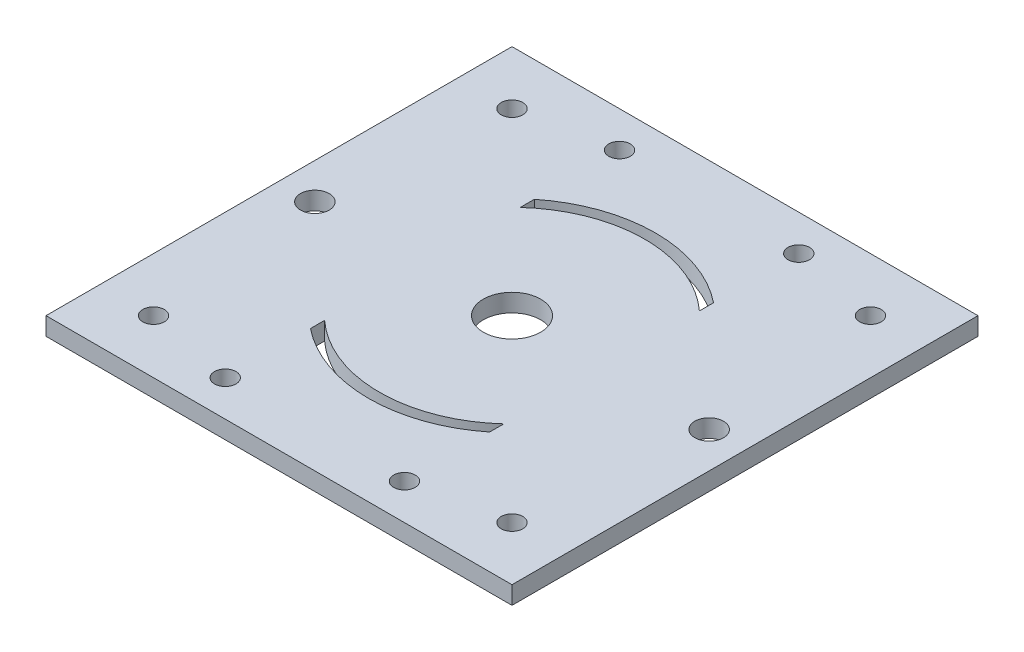
ISO-10303-21;
HEADER;
FILE_DESCRIPTION(('STEP AP214'),'2;1');
FILE_NAME('part.step','',(''),(''),'','','');
FILE_SCHEMA(('AUTOMOTIVE_DESIGN { 1 0 10303 214 1 1 1 1 }'));
ENDSEC;
DATA;
#1=APPLICATION_CONTEXT('core data for automotive mechanical design processes');
#2=APPLICATION_PROTOCOL_DEFINITION('international standard','automotive_design',2000,#1);
#3=PRODUCT_CONTEXT('',#1,'mechanical');
#4=PRODUCT('Part','Part','',(#3));
#5=PRODUCT_RELATED_PRODUCT_CATEGORY('part','',(#4));
#6=PRODUCT_DEFINITION_FORMATION('','',#4);
#7=PRODUCT_DEFINITION_CONTEXT('part definition',#1,'design');
#8=PRODUCT_DEFINITION('design','',#6,#7);
#9=PRODUCT_DEFINITION_SHAPE('','',#8);
#10=(LENGTH_UNIT() NAMED_UNIT(*) SI_UNIT(.MILLI.,.METRE.));
#11=(NAMED_UNIT(*) PLANE_ANGLE_UNIT() SI_UNIT($,.RADIAN.));
#12=(NAMED_UNIT(*) SI_UNIT($,.STERADIAN.) SOLID_ANGLE_UNIT());
#13=UNCERTAINTY_MEASURE_WITH_UNIT(LENGTH_MEASURE(1.E-05),#10,'distance_accuracy_value','');
#14=(GEOMETRIC_REPRESENTATION_CONTEXT(3) GLOBAL_UNCERTAINTY_ASSIGNED_CONTEXT((#13)) GLOBAL_UNIT_ASSIGNED_CONTEXT((#10,
#11,#12)) REPRESENTATION_CONTEXT('',''));
#15=CARTESIAN_POINT('',(0.,0.,0.));
#16=DIRECTION('',(0.,0.,1.));
#17=DIRECTION('',(1.,0.,0.));
#18=AXIS2_PLACEMENT_3D('',#15,#16,#17);
#19=CARTESIAN_POINT('',(0.,5.,0.));
#20=DIRECTION('',(0.,1.,0.));
#21=DIRECTION('',(0.,0.,1.));
#22=AXIS2_PLACEMENT_3D('',#19,#20,#21);
#23=PLANE('',#22);
#24=CARTESIAN_POINT('',(0.,5.,0.));
#25=DIRECTION('',(0.,-1.,0.));
#26=DIRECTION('',(0.,0.,1.));
#27=AXIS2_PLACEMENT_3D('',#24,#25,#26);
#28=CIRCLE('',#27,37.);
#29=CARTESIAN_POINT('',(25.,5.,27.2763633939717));
#30=VERTEX_POINT('',#29);
#31=CARTESIAN_POINT('',(-25.,5.,27.2763633939717));
#32=VERTEX_POINT('',#31);
#33=EDGE_CURVE('E54',#30,#32,#28,.T.);
#34=ORIENTED_EDGE('',*,*,#33,.F.);
#35=DIRECTION('',(0.,0.,-1.));
#36=VECTOR('',#35,1.);
#37=CARTESIAN_POINT('',(25.,5.,27.2763633939717));
#38=LINE('',#37,#36);
#39=CARTESIAN_POINT('',(25.,5.,31.224989991992));
#40=VERTEX_POINT('',#39);
#41=EDGE_CURVE('E153',#40,#30,#38,.T.);
#42=ORIENTED_EDGE('',*,*,#41,.F.);
#43=CARTESIAN_POINT('',(0.,5.,0.));
#44=DIRECTION('',(0.,1.,0.));
#45=DIRECTION('',(0.,0.,1.));
#46=AXIS2_PLACEMENT_3D('',#43,#44,#45);
#47=CIRCLE('',#46,40.);
#48=CARTESIAN_POINT('',(-25.,5.,31.224989991992));
#49=VERTEX_POINT('',#48);
#50=EDGE_CURVE('E135',#49,#40,#47,.T.);
#51=ORIENTED_EDGE('',*,*,#50,.F.);
#52=DIRECTION('',(0.,0.,1.));
#53=VECTOR('',#52,1.);
#54=CARTESIAN_POINT('',(-25.,5.,27.2763633939717));
#55=LINE('',#54,#53);
#56=EDGE_CURVE('E146',#32,#49,#55,.T.);
#57=ORIENTED_EDGE('',*,*,#56,.F.);
#58=EDGE_LOOP('',(#34,#42,#51,#57));
#59=FACE_BOUND('',#58,.T.);
#60=CARTESIAN_POINT('',(0.,5.,0.));
#61=DIRECTION('',(0.,1.,0.));
#62=DIRECTION('',(0.,0.,1.));
#63=AXIS2_PLACEMENT_3D('',#60,#61,#62);
#64=CIRCLE('',#63,40.);
#65=CARTESIAN_POINT('',(25.,5.,-31.224989991992));
#66=VERTEX_POINT('',#65);
#67=CARTESIAN_POINT('',(-25.,5.,-31.224989991992));
#68=VERTEX_POINT('',#67);
#69=EDGE_CURVE('E62',#66,#68,#64,.T.);
#70=ORIENTED_EDGE('',*,*,#69,.F.);
#71=DIRECTION('',(0.,0.,-1.));
#72=VECTOR('',#71,1.);
#73=CARTESIAN_POINT('',(25.,5.,-31.224989991992));
#74=LINE('',#73,#72);
#75=CARTESIAN_POINT('',(25.,5.,-27.2763633939717));
#76=VERTEX_POINT('',#75);
#77=EDGE_CURVE('E178',#76,#66,#74,.T.);
#78=ORIENTED_EDGE('',*,*,#77,.F.);
#79=CARTESIAN_POINT('',(0.,5.,0.));
#80=DIRECTION('',(0.,-1.,0.));
#81=DIRECTION('',(0.,0.,1.));
#82=AXIS2_PLACEMENT_3D('',#79,#80,#81);
#83=CIRCLE('',#82,37.);
#84=CARTESIAN_POINT('',(-25.,5.,-27.2763633939717));
#85=VERTEX_POINT('',#84);
#86=EDGE_CURVE('E174',#85,#76,#83,.T.);
#87=ORIENTED_EDGE('',*,*,#86,.F.);
#88=DIRECTION('',(0.,0.,1.));
#89=VECTOR('',#88,1.);
#90=CARTESIAN_POINT('',(-25.,5.,-31.224989991992));
#91=LINE('',#90,#89);
#92=EDGE_CURVE('E170',#68,#85,#91,.T.);
#93=ORIENTED_EDGE('',*,*,#92,.F.);
#94=EDGE_LOOP('',(#70,#78,#87,#93));
#95=FACE_BOUND('',#94,.T.);
#96=CARTESIAN_POINT('',(25.,5.,-55.));
#97=DIRECTION('',(0.,1.,0.));
#98=DIRECTION('',(0.,0.,-1.));
#99=AXIS2_PLACEMENT_3D('',#96,#97,#98);
#100=CIRCLE('',#99,3.);
#101=CARTESIAN_POINT('',(25.,5.,-58.));
#102=VERTEX_POINT('',#101);
#103=EDGE_CURVE('E198',#102,#102,#100,.T.);
#104=ORIENTED_EDGE('',*,*,#103,.F.);
#105=EDGE_LOOP('',(#104));
#106=FACE_BOUND('',#105,.T.);
#107=CARTESIAN_POINT('',(-25.,5.,55.));
#108=DIRECTION('',(0.,1.,0.));
#109=DIRECTION('',(0.,0.,-1.));
#110=AXIS2_PLACEMENT_3D('',#107,#108,#109);
#111=CIRCLE('',#110,3.);
#112=CARTESIAN_POINT('',(-25.,5.,52.));
#113=VERTEX_POINT('',#112);
#114=EDGE_CURVE('E197',#113,#113,#111,.T.);
#115=ORIENTED_EDGE('',*,*,#114,.F.);
#116=EDGE_LOOP('',(#115));
#117=FACE_BOUND('',#116,.T.);
#118=CARTESIAN_POINT('',(25.,5.,55.));
#119=DIRECTION('',(0.,1.,0.));
#120=DIRECTION('',(0.,0.,1.));
#121=AXIS2_PLACEMENT_3D('',#118,#119,#120);
#122=CIRCLE('',#121,3.);
#123=CARTESIAN_POINT('',(25.,5.,58.));
#124=VERTEX_POINT('',#123);
#125=EDGE_CURVE('E163',#124,#124,#122,.T.);
#126=ORIENTED_EDGE('',*,*,#125,.F.);
#127=EDGE_LOOP('',(#126));
#128=FACE_BOUND('',#127,.T.);
#129=CARTESIAN_POINT('',(-25.,5.,-55.));
#130=DIRECTION('',(0.,1.,0.));
#131=DIRECTION('',(0.,0.,1.));
#132=AXIS2_PLACEMENT_3D('',#129,#130,#131);
#133=CIRCLE('',#132,3.);
#134=CARTESIAN_POINT('',(-25.,5.,-52.));
#135=VERTEX_POINT('',#134);
#136=EDGE_CURVE('E202',#135,#135,#133,.T.);
#137=ORIENTED_EDGE('',*,*,#136,.F.);
#138=EDGE_LOOP('',(#137));
#139=FACE_BOUND('',#138,.T.);
#140=CARTESIAN_POINT('',(-55.,5.,0.));
#141=DIRECTION('',(0.,1.,0.));
#142=DIRECTION('',(0.,0.,1.));
#143=AXIS2_PLACEMENT_3D('',#140,#141,#142);
#144=CIRCLE('',#143,4.00000000000001);
#145=CARTESIAN_POINT('',(-55.,5.,4.00000000000001));
#146=VERTEX_POINT('',#145);
#147=EDGE_CURVE('E210',#146,#146,#144,.T.);
#148=ORIENTED_EDGE('',*,*,#147,.F.);
#149=EDGE_LOOP('',(#148));
#150=FACE_BOUND('',#149,.T.);
#151=CARTESIAN_POINT('',(55.,5.,0.));
#152=DIRECTION('',(0.,1.,0.));
#153=DIRECTION('',(0.,0.,-1.));
#154=AXIS2_PLACEMENT_3D('',#151,#152,#153);
#155=CIRCLE('',#154,4.00000000000001);
#156=CARTESIAN_POINT('',(55.,5.,-4.00000000000001));
#157=VERTEX_POINT('',#156);
#158=EDGE_CURVE('E220',#157,#157,#155,.T.);
#159=ORIENTED_EDGE('',*,*,#158,.F.);
#160=EDGE_LOOP('',(#159));
#161=FACE_BOUND('',#160,.T.);
#162=CARTESIAN_POINT('',(0.,5.,0.));
#163=DIRECTION('',(0.,1.,0.));
#164=DIRECTION('',(0.,0.,1.));
#165=AXIS2_PLACEMENT_3D('',#162,#163,#164);
#166=CIRCLE('',#165,8.);
#167=CARTESIAN_POINT('',(0.,5.,8.));
#168=VERTEX_POINT('',#167);
#169=EDGE_CURVE('E219',#168,#168,#166,.T.);
#170=ORIENTED_EDGE('',*,*,#169,.F.);
#171=EDGE_LOOP('',(#170));
#172=FACE_BOUND('',#171,.T.);
#173=CARTESIAN_POINT('',(50.,5.,50.));
#174=DIRECTION('',(0.,1.,0.));
#175=DIRECTION('',(0.,0.,1.));
#176=AXIS2_PLACEMENT_3D('',#173,#174,#175);
#177=CIRCLE('',#176,3.);
#178=CARTESIAN_POINT('',(50.,5.,53.));
#179=VERTEX_POINT('',#178);
#180=EDGE_CURVE('E244',#179,#179,#177,.T.);
#181=ORIENTED_EDGE('',*,*,#180,.F.);
#182=EDGE_LOOP('',(#181));
#183=FACE_BOUND('',#182,.T.);
#184=CARTESIAN_POINT('',(-50.,5.,-50.));
#185=DIRECTION('',(0.,1.,0.));
#186=DIRECTION('',(0.,0.,1.));
#187=AXIS2_PLACEMENT_3D('',#184,#185,#186);
#188=CIRCLE('',#187,3.);
#189=CARTESIAN_POINT('',(-50.,5.,-47.));
#190=VERTEX_POINT('',#189);
#191=EDGE_CURVE('E260',#190,#190,#188,.T.);
#192=ORIENTED_EDGE('',*,*,#191,.F.);
#193=EDGE_LOOP('',(#192));
#194=FACE_BOUND('',#193,.T.);
#195=DIRECTION('',(0.,0.,-1.));
#196=VECTOR('',#195,1.);
#197=CARTESIAN_POINT('',(65.,5.,-65.));
#198=LINE('',#197,#196);
#199=CARTESIAN_POINT('',(65.,5.,65.));
#200=VERTEX_POINT('',#199);
#201=CARTESIAN_POINT('',(65.,5.,-65.));
#202=VERTEX_POINT('',#201);
#203=EDGE_CURVE('E268',#200,#202,#198,.T.);
#204=ORIENTED_EDGE('',*,*,#203,.T.);
#205=DIRECTION('',(-1.,0.,0.));
#206=VECTOR('',#205,1.);
#207=CARTESIAN_POINT('',(-65.,5.,-65.));
#208=LINE('',#207,#206);
#209=CARTESIAN_POINT('',(-65.,5.,-65.));
#210=VERTEX_POINT('',#209);
#211=EDGE_CURVE('E272',#202,#210,#208,.T.);
#212=ORIENTED_EDGE('',*,*,#211,.T.);
#213=DIRECTION('',(0.,0.,1.));
#214=VECTOR('',#213,1.);
#215=CARTESIAN_POINT('',(-65.,5.,-65.));
#216=LINE('',#215,#214);
#217=CARTESIAN_POINT('',(-65.,5.,65.));
#218=VERTEX_POINT('',#217);
#219=EDGE_CURVE('E276',#210,#218,#216,.T.);
#220=ORIENTED_EDGE('',*,*,#219,.T.);
#221=DIRECTION('',(1.,0.,0.));
#222=VECTOR('',#221,1.);
#223=CARTESIAN_POINT('',(-65.,5.,65.));
#224=LINE('',#223,#222);
#225=EDGE_CURVE('E279',#218,#200,#224,.T.);
#226=ORIENTED_EDGE('',*,*,#225,.T.);
#227=EDGE_LOOP('',(#204,#212,#220,#226));
#228=FACE_BOUND('',#227,.T.);
#229=CARTESIAN_POINT('',(50.,5.,-50.));
#230=DIRECTION('',(0.,1.,0.));
#231=DIRECTION('',(0.,0.,-1.));
#232=AXIS2_PLACEMENT_3D('',#229,#230,#231);
#233=CIRCLE('',#232,3.);
#234=CARTESIAN_POINT('',(50.,5.,-53.));
#235=VERTEX_POINT('',#234);
#236=EDGE_CURVE('E252',#235,#235,#233,.T.);
#237=ORIENTED_EDGE('',*,*,#236,.F.);
#238=EDGE_LOOP('',(#237));
#239=FACE_BOUND('',#238,.T.);
#240=CARTESIAN_POINT('',(-50.,5.,50.));
#241=DIRECTION('',(0.,1.,0.));
#242=DIRECTION('',(0.,0.,-1.));
#243=AXIS2_PLACEMENT_3D('',#240,#241,#242);
#244=CIRCLE('',#243,3.);
#245=CARTESIAN_POINT('',(-50.,5.,47.));
#246=VERTEX_POINT('',#245);
#247=EDGE_CURVE('E236',#246,#246,#244,.T.);
#248=ORIENTED_EDGE('',*,*,#247,.F.);
#249=EDGE_LOOP('',(#248));
#250=FACE_BOUND('',#249,.T.);
#251=ADVANCED_FACE('F38',(#59,#95,#106,#117,#128,#139,#150,#161,#172,#183,#194,#228,#239,#250),
#23,.T.);
#252=CARTESIAN_POINT('',(0.,0.,0.));
#253=DIRECTION('',(0.,1.,0.));
#254=DIRECTION('',(0.,0.,1.));
#255=AXIS2_PLACEMENT_3D('',#252,#253,#254);
#256=PLANE('',#255);
#257=DIRECTION('',(0.,0.,-1.));
#258=VECTOR('',#257,1.);
#259=CARTESIAN_POINT('',(25.,0.,0.));
#260=LINE('',#259,#258);
#261=CARTESIAN_POINT('',(25.,0.,31.224989991992));
#262=VERTEX_POINT('',#261);
#263=CARTESIAN_POINT('',(25.,0.,27.2763633939717));
#264=VERTEX_POINT('',#263);
#265=EDGE_CURVE('E47',#262,#264,#260,.T.);
#266=ORIENTED_EDGE('',*,*,#265,.T.);
#267=CARTESIAN_POINT('',(0.,0.,0.));
#268=DIRECTION('',(0.,1.,0.));
#269=DIRECTION('',(0.,0.,1.));
#270=AXIS2_PLACEMENT_3D('',#267,#268,#269);
#271=CIRCLE('',#270,37.);
#272=CARTESIAN_POINT('',(-25.,0.,27.2763633939717));
#273=VERTEX_POINT('',#272);
#274=EDGE_CURVE('E11',#264,#273,#271,.F.);
#275=ORIENTED_EDGE('',*,*,#274,.T.);
#276=DIRECTION('',(0.,0.,1.));
#277=VECTOR('',#276,1.);
#278=CARTESIAN_POINT('',(-24.9999999999999,0.,0.));
#279=LINE('',#278,#277);
#280=CARTESIAN_POINT('',(-25.,0.,31.224989991992));
#281=VERTEX_POINT('',#280);
#282=EDGE_CURVE('E339',#273,#281,#279,.T.);
#283=ORIENTED_EDGE('',*,*,#282,.T.);
#284=CARTESIAN_POINT('',(0.,0.,0.));
#285=DIRECTION('',(0.,1.,0.));
#286=DIRECTION('',(0.,0.,1.));
#287=AXIS2_PLACEMENT_3D('',#284,#285,#286);
#288=CIRCLE('',#287,40.);
#289=EDGE_CURVE('E138',#281,#262,#288,.T.);
#290=ORIENTED_EDGE('',*,*,#289,.T.);
#291=EDGE_LOOP('',(#266,#275,#283,#290));
#292=FACE_BOUND('',#291,.T.);
#293=DIRECTION('',(0.,0.,-1.));
#294=VECTOR('',#293,1.);
#295=CARTESIAN_POINT('',(24.9999999999999,0.,0.));
#296=LINE('',#295,#294);
#297=CARTESIAN_POINT('',(25.,0.,-27.2763633939717));
#298=VERTEX_POINT('',#297);
#299=CARTESIAN_POINT('',(25.,0.,-31.224989991992));
#300=VERTEX_POINT('',#299);
#301=EDGE_CURVE('E331',#298,#300,#296,.T.);
#302=ORIENTED_EDGE('',*,*,#301,.T.);
#303=CARTESIAN_POINT('',(0.,0.,0.));
#304=DIRECTION('',(0.,1.,0.));
#305=DIRECTION('',(0.,0.,1.));
#306=AXIS2_PLACEMENT_3D('',#303,#304,#305);
#307=CIRCLE('',#306,40.);
#308=CARTESIAN_POINT('',(-25.,0.,-31.224989991992));
#309=VERTEX_POINT('',#308);
#310=EDGE_CURVE('E335',#300,#309,#307,.T.);
#311=ORIENTED_EDGE('',*,*,#310,.T.);
#312=DIRECTION('',(0.,0.,1.));
#313=VECTOR('',#312,1.);
#314=CARTESIAN_POINT('',(-25.,0.,0.));
#315=LINE('',#314,#313);
#316=CARTESIAN_POINT('',(-25.,0.,-27.2763633939717));
#317=VERTEX_POINT('',#316);
#318=EDGE_CURVE('E309',#309,#317,#315,.T.);
#319=ORIENTED_EDGE('',*,*,#318,.T.);
#320=CARTESIAN_POINT('',(0.,0.,0.));
#321=DIRECTION('',(0.,1.,0.));
#322=DIRECTION('',(0.,0.,1.));
#323=AXIS2_PLACEMENT_3D('',#320,#321,#322);
#324=CIRCLE('',#323,37.);
#325=EDGE_CURVE('E327',#317,#298,#324,.F.);
#326=ORIENTED_EDGE('',*,*,#325,.T.);
#327=EDGE_LOOP('',(#302,#311,#319,#326));
#328=FACE_BOUND('',#327,.T.);
#329=CARTESIAN_POINT('',(25.,0.,-55.));
#330=DIRECTION('',(0.,1.,0.));
#331=DIRECTION('',(0.,0.,1.));
#332=AXIS2_PLACEMENT_3D('',#329,#330,#331);
#333=CIRCLE('',#332,3.);
#334=CARTESIAN_POINT('',(25.,0.,-52.));
#335=VERTEX_POINT('',#334);
#336=EDGE_CURVE('E224',#335,#335,#333,.T.);
#337=ORIENTED_EDGE('',*,*,#336,.T.);
#338=EDGE_LOOP('',(#337));
#339=FACE_BOUND('',#338,.T.);
#340=CARTESIAN_POINT('',(-25.,0.,55.));
#341=DIRECTION('',(0.,1.,0.));
#342=DIRECTION('',(0.,0.,1.));
#343=AXIS2_PLACEMENT_3D('',#340,#341,#342);
#344=CIRCLE('',#343,3.);
#345=CARTESIAN_POINT('',(-25.,0.,58.));
#346=VERTEX_POINT('',#345);
#347=EDGE_CURVE('E317',#346,#346,#344,.T.);
#348=ORIENTED_EDGE('',*,*,#347,.T.);
#349=EDGE_LOOP('',(#348));
#350=FACE_BOUND('',#349,.T.);
#351=CARTESIAN_POINT('',(25.,0.,55.));
#352=DIRECTION('',(0.,1.,0.));
#353=DIRECTION('',(0.,0.,1.));
#354=AXIS2_PLACEMENT_3D('',#351,#352,#353);
#355=CIRCLE('',#354,3.);
#356=CARTESIAN_POINT('',(25.,0.,58.));
#357=VERTEX_POINT('',#356);
#358=EDGE_CURVE('E313',#357,#357,#355,.T.);
#359=ORIENTED_EDGE('',*,*,#358,.T.);
#360=EDGE_LOOP('',(#359));
#361=FACE_BOUND('',#360,.T.);
#362=CARTESIAN_POINT('',(-25.,0.,-55.));
#363=DIRECTION('',(0.,1.,0.));
#364=DIRECTION('',(0.,0.,1.));
#365=AXIS2_PLACEMENT_3D('',#362,#363,#364);
#366=CIRCLE('',#365,3.);
#367=CARTESIAN_POINT('',(-25.,0.,-52.));
#368=VERTEX_POINT('',#367);
#369=EDGE_CURVE('E209',#368,#368,#366,.T.);
#370=ORIENTED_EDGE('',*,*,#369,.T.);
#371=EDGE_LOOP('',(#370));
#372=FACE_BOUND('',#371,.T.);
#373=CARTESIAN_POINT('',(-55.,0.,0.));
#374=DIRECTION('',(0.,1.,0.));
#375=DIRECTION('',(0.,0.,1.));
#376=AXIS2_PLACEMENT_3D('',#373,#374,#375);
#377=CIRCLE('',#376,4.00000000000001);
#378=CARTESIAN_POINT('',(-55.,0.,4.00000000000001));
#379=VERTEX_POINT('',#378);
#380=EDGE_CURVE('E214',#379,#379,#377,.F.);
#381=ORIENTED_EDGE('',*,*,#380,.F.);
#382=EDGE_LOOP('',(#381));
#383=FACE_BOUND('',#382,.T.);
#384=CARTESIAN_POINT('',(55.,0.,0.));
#385=DIRECTION('',(0.,1.,0.));
#386=DIRECTION('',(0.,0.,1.));
#387=AXIS2_PLACEMENT_3D('',#384,#385,#386);
#388=CIRCLE('',#387,4.00000000000001);
#389=CARTESIAN_POINT('',(55.,0.,4.00000000000001));
#390=VERTEX_POINT('',#389);
#391=EDGE_CURVE('E215',#390,#390,#388,.F.);
#392=ORIENTED_EDGE('',*,*,#391,.F.);
#393=EDGE_LOOP('',(#392));
#394=FACE_BOUND('',#393,.T.);
#395=CARTESIAN_POINT('',(0.,0.,0.));
#396=DIRECTION('',(0.,1.,0.));
#397=DIRECTION('',(0.,0.,1.));
#398=AXIS2_PLACEMENT_3D('',#395,#396,#397);
#399=CIRCLE('',#398,8.);
#400=CARTESIAN_POINT('',(0.,0.,8.));
#401=VERTEX_POINT('',#400);
#402=EDGE_CURVE('E231',#401,#401,#399,.F.);
#403=ORIENTED_EDGE('',*,*,#402,.F.);
#404=EDGE_LOOP('',(#403));
#405=FACE_BOUND('',#404,.T.);
#406=DIRECTION('',(0.,0.,-1.));
#407=VECTOR('',#406,1.);
#408=CARTESIAN_POINT('',(65.,0.,-65.));
#409=LINE('',#408,#407);
#410=CARTESIAN_POINT('',(65.,0.,65.));
#411=VERTEX_POINT('',#410);
#412=CARTESIAN_POINT('',(65.,0.,-65.));
#413=VERTEX_POINT('',#412);
#414=EDGE_CURVE('E264',#411,#413,#409,.T.);
#415=ORIENTED_EDGE('',*,*,#414,.F.);
#416=DIRECTION('',(1.,0.,0.));
#417=VECTOR('',#416,1.);
#418=CARTESIAN_POINT('',(-65.,0.,65.));
#419=LINE('',#418,#417);
#420=CARTESIAN_POINT('',(-65.,0.,65.));
#421=VERTEX_POINT('',#420);
#422=EDGE_CURVE('E273',#421,#411,#419,.T.);
#423=ORIENTED_EDGE('',*,*,#422,.F.);
#424=DIRECTION('',(0.,0.,1.));
#425=VECTOR('',#424,1.);
#426=CARTESIAN_POINT('',(-65.,0.,-65.));
#427=LINE('',#426,#425);
#428=CARTESIAN_POINT('',(-65.,0.,-65.));
#429=VERTEX_POINT('',#428);
#430=EDGE_CURVE('E289',#429,#421,#427,.T.);
#431=ORIENTED_EDGE('',*,*,#430,.F.);
#432=DIRECTION('',(-1.,0.,0.));
#433=VECTOR('',#432,1.);
#434=CARTESIAN_POINT('',(-65.,0.,-65.));
#435=LINE('',#434,#433);
#436=EDGE_CURVE('E286',#413,#429,#435,.T.);
#437=ORIENTED_EDGE('',*,*,#436,.F.);
#438=EDGE_LOOP('',(#415,#423,#431,#437));
#439=FACE_BOUND('',#438,.T.);
#440=CARTESIAN_POINT('',(-50.,0.,-50.));
#441=DIRECTION('',(0.,1.,0.));
#442=DIRECTION('',(0.,0.,1.));
#443=AXIS2_PLACEMENT_3D('',#440,#441,#442);
#444=CIRCLE('',#443,3.);
#445=CARTESIAN_POINT('',(-50.,0.,-47.));
#446=VERTEX_POINT('',#445);
#447=EDGE_CURVE('E256',#446,#446,#444,.T.);
#448=ORIENTED_EDGE('',*,*,#447,.T.);
#449=EDGE_LOOP('',(#448));
#450=FACE_BOUND('',#449,.T.);
#451=CARTESIAN_POINT('',(50.,0.,-50.));
#452=DIRECTION('',(0.,1.,0.));
#453=DIRECTION('',(0.,0.,-1.));
#454=AXIS2_PLACEMENT_3D('',#451,#452,#453);
#455=CIRCLE('',#454,3.);
#456=CARTESIAN_POINT('',(50.,0.,-53.));
#457=VERTEX_POINT('',#456);
#458=EDGE_CURVE('E248',#457,#457,#455,.T.);
#459=ORIENTED_EDGE('',*,*,#458,.T.);
#460=EDGE_LOOP('',(#459));
#461=FACE_BOUND('',#460,.T.);
#462=CARTESIAN_POINT('',(50.,0.,50.));
#463=DIRECTION('',(0.,1.,0.));
#464=DIRECTION('',(0.,0.,1.));
#465=AXIS2_PLACEMENT_3D('',#462,#463,#464);
#466=CIRCLE('',#465,3.);
#467=CARTESIAN_POINT('',(50.,0.,53.));
#468=VERTEX_POINT('',#467);
#469=EDGE_CURVE('E240',#468,#468,#466,.T.);
#470=ORIENTED_EDGE('',*,*,#469,.T.);
#471=EDGE_LOOP('',(#470));
#472=FACE_BOUND('',#471,.T.);
#473=CARTESIAN_POINT('',(-50.,0.,50.));
#474=DIRECTION('',(0.,1.,0.));
#475=DIRECTION('',(0.,0.,-1.));
#476=AXIS2_PLACEMENT_3D('',#473,#474,#475);
#477=CIRCLE('',#476,3.);
#478=CARTESIAN_POINT('',(-50.,0.,47.));
#479=VERTEX_POINT('',#478);
#480=EDGE_CURVE('E235',#479,#479,#477,.T.);
#481=ORIENTED_EDGE('',*,*,#480,.T.);
#482=EDGE_LOOP('',(#481));
#483=FACE_BOUND('',#482,.T.);
#484=ADVANCED_FACE('F346',(#292,#328,#339,#350,#361,#372,#383,#394,#405,#439,#450,#461,#472,
#483),#256,.F.);
#485=CARTESIAN_POINT('',(65.,5.,-65.));
#486=DIRECTION('',(-1.,0.,0.));
#487=DIRECTION('',(0.,0.,1.));
#488=AXIS2_PLACEMENT_3D('',#485,#486,#487);
#489=PLANE('',#488);
#490=ORIENTED_EDGE('',*,*,#414,.T.);
#491=DIRECTION('',(0.,-1.,0.));
#492=VECTOR('',#491,1.);
#493=CARTESIAN_POINT('',(65.,5.,-65.));
#494=LINE('',#493,#492);
#495=EDGE_CURVE('E305',#202,#413,#494,.T.);
#496=ORIENTED_EDGE('',*,*,#495,.F.);
#497=ORIENTED_EDGE('',*,*,#203,.F.);
#498=DIRECTION('',(0.,-1.,0.));
#499=VECTOR('',#498,1.);
#500=CARTESIAN_POINT('',(65.,5.,65.));
#501=LINE('',#500,#499);
#502=EDGE_CURVE('E282',#200,#411,#501,.T.);
#503=ORIENTED_EDGE('',*,*,#502,.T.);
#504=EDGE_LOOP('',(#490,#496,#497,#503));
#505=FACE_BOUND('',#504,.T.);
#506=ADVANCED_FACE('F40',(#505),#489,.F.);
#507=CARTESIAN_POINT('',(-65.,5.,-65.));
#508=DIRECTION('',(0.,0.,1.));
#509=DIRECTION('',(1.,0.,0.));
#510=AXIS2_PLACEMENT_3D('',#507,#508,#509);
#511=PLANE('',#510);
#512=ORIENTED_EDGE('',*,*,#436,.T.);
#513=DIRECTION('',(0.,-1.,0.));
#514=VECTOR('',#513,1.);
#515=CARTESIAN_POINT('',(-65.,5.,-65.));
#516=LINE('',#515,#514);
#517=EDGE_CURVE('E301',#210,#429,#516,.T.);
#518=ORIENTED_EDGE('',*,*,#517,.F.);
#519=ORIENTED_EDGE('',*,*,#211,.F.);
#520=ORIENTED_EDGE('',*,*,#495,.T.);
#521=EDGE_LOOP('',(#512,#518,#519,#520));
#522=FACE_BOUND('',#521,.T.);
#523=ADVANCED_FACE('F382',(#522),#511,.F.);
#524=CARTESIAN_POINT('',(-65.,5.,-65.));
#525=DIRECTION('',(1.,0.,0.));
#526=DIRECTION('',(0.,0.,-1.));
#527=AXIS2_PLACEMENT_3D('',#524,#525,#526);
#528=PLANE('',#527);
#529=ORIENTED_EDGE('',*,*,#430,.T.);
#530=DIRECTION('',(0.,-1.,0.));
#531=VECTOR('',#530,1.);
#532=CARTESIAN_POINT('',(-65.,5.,65.));
#533=LINE('',#532,#531);
#534=EDGE_CURVE('E297',#218,#421,#533,.T.);
#535=ORIENTED_EDGE('',*,*,#534,.F.);
#536=ORIENTED_EDGE('',*,*,#219,.F.);
#537=ORIENTED_EDGE('',*,*,#517,.T.);
#538=EDGE_LOOP('',(#529,#535,#536,#537));
#539=FACE_BOUND('',#538,.T.);
#540=ADVANCED_FACE('F379',(#539),#528,.F.);
#541=CARTESIAN_POINT('',(-65.,5.,65.));
#542=DIRECTION('',(0.,0.,-1.));
#543=DIRECTION('',(-1.,0.,0.));
#544=AXIS2_PLACEMENT_3D('',#541,#542,#543);
#545=PLANE('',#544);
#546=ORIENTED_EDGE('',*,*,#422,.T.);
#547=ORIENTED_EDGE('',*,*,#502,.F.);
#548=ORIENTED_EDGE('',*,*,#225,.F.);
#549=ORIENTED_EDGE('',*,*,#534,.T.);
#550=EDGE_LOOP('',(#546,#547,#548,#549));
#551=FACE_BOUND('',#550,.T.);
#552=ADVANCED_FACE('F376',(#551),#545,.F.);
#553=CARTESIAN_POINT('',(-50.,5.,-50.));
#554=DIRECTION('',(0.,-1.,0.));
#555=DIRECTION('',(0.,0.,-1.));
#556=AXIS2_PLACEMENT_3D('',#553,#554,#555);
#557=CYLINDRICAL_SURFACE('',#556,3.);
#558=ORIENTED_EDGE('',*,*,#191,.T.);
#559=EDGE_LOOP('',(#558));
#560=FACE_BOUND('',#559,.T.);
#561=ORIENTED_EDGE('',*,*,#447,.F.);
#562=EDGE_LOOP('',(#561));
#563=FACE_BOUND('',#562,.T.);
#564=ADVANCED_FACE('F373',(#560,#563),#557,.F.);
#565=CARTESIAN_POINT('',(50.,5.,-50.));
#566=DIRECTION('',(0.,-1.,0.));
#567=DIRECTION('',(0.,0.,-1.));
#568=AXIS2_PLACEMENT_3D('',#565,#566,#567);
#569=CYLINDRICAL_SURFACE('',#568,3.);
#570=ORIENTED_EDGE('',*,*,#236,.T.);
#571=EDGE_LOOP('',(#570));
#572=FACE_BOUND('',#571,.T.);
#573=ORIENTED_EDGE('',*,*,#458,.F.);
#574=EDGE_LOOP('',(#573));
#575=FACE_BOUND('',#574,.T.);
#576=ADVANCED_FACE('F423',(#572,#575),#569,.F.);
#577=CARTESIAN_POINT('',(50.,5.,50.));
#578=DIRECTION('',(0.,-1.,0.));
#579=DIRECTION('',(0.,0.,-1.));
#580=AXIS2_PLACEMENT_3D('',#577,#578,#579);
#581=CYLINDRICAL_SURFACE('',#580,3.);
#582=ORIENTED_EDGE('',*,*,#180,.T.);
#583=EDGE_LOOP('',(#582));
#584=FACE_BOUND('',#583,.T.);
#585=ORIENTED_EDGE('',*,*,#469,.F.);
#586=EDGE_LOOP('',(#585));
#587=FACE_BOUND('',#586,.T.);
#588=ADVANCED_FACE('F412',(#584,#587),#581,.F.);
#589=CARTESIAN_POINT('',(-50.,5.,50.));
#590=DIRECTION('',(0.,-1.,0.));
#591=DIRECTION('',(0.,0.,-1.));
#592=AXIS2_PLACEMENT_3D('',#589,#590,#591);
#593=CYLINDRICAL_SURFACE('',#592,3.);
#594=ORIENTED_EDGE('',*,*,#247,.T.);
#595=EDGE_LOOP('',(#594));
#596=FACE_BOUND('',#595,.T.);
#597=ORIENTED_EDGE('',*,*,#480,.F.);
#598=EDGE_LOOP('',(#597));
#599=FACE_BOUND('',#598,.T.);
#600=ADVANCED_FACE('F408',(#596,#599),#593,.F.);
#601=CARTESIAN_POINT('',(0.,-22.6274169979695,0.));
#602=DIRECTION('',(0.,1.,0.));
#603=DIRECTION('',(0.,0.,1.));
#604=AXIS2_PLACEMENT_3D('',#601,#602,#603);
#605=CYLINDRICAL_SURFACE('',#604,8.);
#606=ORIENTED_EDGE('',*,*,#402,.T.);
#607=EDGE_LOOP('',(#606));
#608=FACE_BOUND('',#607,.T.);
#609=ORIENTED_EDGE('',*,*,#169,.T.);
#610=EDGE_LOOP('',(#609));
#611=FACE_BOUND('',#610,.T.);
#612=ADVANCED_FACE('F411',(#608,#611),#605,.F.);
#613=CARTESIAN_POINT('',(55.,-11.3137084989848,0.));
#614=DIRECTION('',(0.,1.,0.));
#615=DIRECTION('',(0.,0.,1.));
#616=AXIS2_PLACEMENT_3D('',#613,#614,#615);
#617=CYLINDRICAL_SURFACE('',#616,4.00000000000001);
#618=ORIENTED_EDGE('',*,*,#391,.T.);
#619=EDGE_LOOP('',(#618));
#620=FACE_BOUND('',#619,.T.);
#621=ORIENTED_EDGE('',*,*,#158,.T.);
#622=EDGE_LOOP('',(#621));
#623=FACE_BOUND('',#622,.T.);
#624=ADVANCED_FACE('F420',(#620,#623),#617,.F.);
#625=CARTESIAN_POINT('',(-55.,-11.3137084989848,0.));
#626=DIRECTION('',(0.,1.,0.));
#627=DIRECTION('',(0.,0.,1.));
#628=AXIS2_PLACEMENT_3D('',#625,#626,#627);
#629=CYLINDRICAL_SURFACE('',#628,4.00000000000001);
#630=ORIENTED_EDGE('',*,*,#380,.T.);
#631=EDGE_LOOP('',(#630));
#632=FACE_BOUND('',#631,.T.);
#633=ORIENTED_EDGE('',*,*,#147,.T.);
#634=EDGE_LOOP('',(#633));
#635=FACE_BOUND('',#634,.T.);
#636=ADVANCED_FACE('F552',(#632,#635),#629,.F.);
#637=CARTESIAN_POINT('',(-25.,-5.,-55.));
#638=DIRECTION('',(0.,1.,0.));
#639=DIRECTION('',(0.,0.,1.));
#640=AXIS2_PLACEMENT_3D('',#637,#638,#639);
#641=CYLINDRICAL_SURFACE('',#640,3.);
#642=ORIENTED_EDGE('',*,*,#136,.T.);
#643=EDGE_LOOP('',(#642));
#644=FACE_BOUND('',#643,.T.);
#645=ORIENTED_EDGE('',*,*,#369,.F.);
#646=EDGE_LOOP('',(#645));
#647=FACE_BOUND('',#646,.T.);
#648=ADVANCED_FACE('F543',(#644,#647),#641,.F.);
#649=CARTESIAN_POINT('',(25.,-5.,55.));
#650=DIRECTION('',(0.,1.,0.));
#651=DIRECTION('',(0.,0.,1.));
#652=AXIS2_PLACEMENT_3D('',#649,#650,#651);
#653=CYLINDRICAL_SURFACE('',#652,3.);
#654=ORIENTED_EDGE('',*,*,#125,.T.);
#655=EDGE_LOOP('',(#654));
#656=FACE_BOUND('',#655,.T.);
#657=ORIENTED_EDGE('',*,*,#358,.F.);
#658=EDGE_LOOP('',(#657));
#659=FACE_BOUND('',#658,.T.);
#660=ADVANCED_FACE('F539',(#656,#659),#653,.F.);
#661=CARTESIAN_POINT('',(-25.,-5.,55.));
#662=DIRECTION('',(0.,1.,0.));
#663=DIRECTION('',(0.,0.,1.));
#664=AXIS2_PLACEMENT_3D('',#661,#662,#663);
#665=CYLINDRICAL_SURFACE('',#664,3.);
#666=ORIENTED_EDGE('',*,*,#114,.T.);
#667=EDGE_LOOP('',(#666));
#668=FACE_BOUND('',#667,.T.);
#669=ORIENTED_EDGE('',*,*,#347,.F.);
#670=EDGE_LOOP('',(#669));
#671=FACE_BOUND('',#670,.T.);
#672=ADVANCED_FACE('F542',(#668,#671),#665,.F.);
#673=CARTESIAN_POINT('',(25.,-5.,-55.));
#674=DIRECTION('',(0.,1.,0.));
#675=DIRECTION('',(0.,0.,1.));
#676=AXIS2_PLACEMENT_3D('',#673,#674,#675);
#677=CYLINDRICAL_SURFACE('',#676,3.);
#678=ORIENTED_EDGE('',*,*,#103,.T.);
#679=EDGE_LOOP('',(#678));
#680=FACE_BOUND('',#679,.T.);
#681=ORIENTED_EDGE('',*,*,#336,.F.);
#682=EDGE_LOOP('',(#681));
#683=FACE_BOUND('',#682,.T.);
#684=ADVANCED_FACE('F484',(#680,#683),#677,.F.);
#685=CARTESIAN_POINT('',(0.,-5.,0.));
#686=DIRECTION('',(0.,1.,0.));
#687=DIRECTION('',(0.,0.,1.));
#688=AXIS2_PLACEMENT_3D('',#685,#686,#687);
#689=CYLINDRICAL_SURFACE('',#688,40.);
#690=DIRECTION('',(0.,1.,0.));
#691=VECTOR('',#690,1.);
#692=CARTESIAN_POINT('',(25.,-5.,-31.224989991992));
#693=LINE('',#692,#691);
#694=EDGE_CURVE('E183',#300,#66,#693,.T.);
#695=ORIENTED_EDGE('',*,*,#694,.T.);
#696=ORIENTED_EDGE('',*,*,#69,.T.);
#697=DIRECTION('',(0.,1.,0.));
#698=VECTOR('',#697,1.);
#699=CARTESIAN_POINT('',(-25.,-5.,-31.224989991992));
#700=LINE('',#699,#698);
#701=EDGE_CURVE('E182',#309,#68,#700,.T.);
#702=ORIENTED_EDGE('',*,*,#701,.F.);
#703=ORIENTED_EDGE('',*,*,#310,.F.);
#704=EDGE_LOOP('',(#695,#696,#702,#703));
#705=FACE_BOUND('',#704,.T.);
#706=ADVANCED_FACE('F478',(#705),#689,.F.);
#707=CARTESIAN_POINT('',(25.,-5.,-31.224989991992));
#708=DIRECTION('',(1.,0.,0.));
#709=DIRECTION('',(0.,0.,-1.));
#710=AXIS2_PLACEMENT_3D('',#707,#708,#709);
#711=PLANE('',#710);
#712=DIRECTION('',(0.,1.,0.));
#713=VECTOR('',#712,1.);
#714=CARTESIAN_POINT('',(25.,-5.,-27.2763633939717));
#715=LINE('',#714,#713);
#716=EDGE_CURVE('E186',#298,#76,#715,.T.);
#717=ORIENTED_EDGE('',*,*,#716,.T.);
#718=ORIENTED_EDGE('',*,*,#77,.T.);
#719=ORIENTED_EDGE('',*,*,#694,.F.);
#720=ORIENTED_EDGE('',*,*,#301,.F.);
#721=EDGE_LOOP('',(#717,#718,#719,#720));
#722=FACE_BOUND('',#721,.T.);
#723=ADVANCED_FACE('F483',(#722),#711,.F.);
#724=CARTESIAN_POINT('',(0.,-5.,0.));
#725=DIRECTION('',(0.,1.,0.));
#726=DIRECTION('',(0.,0.,1.));
#727=AXIS2_PLACEMENT_3D('',#724,#725,#726);
#728=CYLINDRICAL_SURFACE('',#727,37.);
#729=DIRECTION('',(0.,1.,0.));
#730=VECTOR('',#729,1.);
#731=CARTESIAN_POINT('',(-25.,-5.,-27.2763633939717));
#732=LINE('',#731,#730);
#733=EDGE_CURVE('E189',#317,#85,#732,.T.);
#734=ORIENTED_EDGE('',*,*,#733,.T.);
#735=ORIENTED_EDGE('',*,*,#86,.T.);
#736=ORIENTED_EDGE('',*,*,#716,.F.);
#737=ORIENTED_EDGE('',*,*,#325,.F.);
#738=EDGE_LOOP('',(#734,#735,#736,#737));
#739=FACE_BOUND('',#738,.T.);
#740=ADVANCED_FACE('F360',(#739),#728,.T.);
#741=CARTESIAN_POINT('',(-25.,-5.,-31.224989991992));
#742=DIRECTION('',(-1.,0.,0.));
#743=DIRECTION('',(0.,0.,1.));
#744=AXIS2_PLACEMENT_3D('',#741,#742,#743);
#745=PLANE('',#744);
#746=ORIENTED_EDGE('',*,*,#701,.T.);
#747=ORIENTED_EDGE('',*,*,#92,.T.);
#748=ORIENTED_EDGE('',*,*,#733,.F.);
#749=ORIENTED_EDGE('',*,*,#318,.F.);
#750=EDGE_LOOP('',(#746,#747,#748,#749));
#751=FACE_BOUND('',#750,.T.);
#752=ADVANCED_FACE('F353',(#751),#745,.F.);
#753=CARTESIAN_POINT('',(0.,-5.,0.));
#754=DIRECTION('',(0.,1.,0.));
#755=DIRECTION('',(0.,0.,1.));
#756=AXIS2_PLACEMENT_3D('',#753,#754,#755);
#757=CYLINDRICAL_SURFACE('',#756,37.);
#758=DIRECTION('',(0.,1.,0.));
#759=VECTOR('',#758,1.);
#760=CARTESIAN_POINT('',(25.,-5.,27.2763633939717));
#761=LINE('',#760,#759);
#762=EDGE_CURVE('E160',#264,#30,#761,.T.);
#763=ORIENTED_EDGE('',*,*,#762,.T.);
#764=ORIENTED_EDGE('',*,*,#33,.T.);
#765=DIRECTION('',(0.,1.,0.));
#766=VECTOR('',#765,1.);
#767=CARTESIAN_POINT('',(-25.,-5.,27.2763633939717));
#768=LINE('',#767,#766);
#769=EDGE_CURVE('E143',#273,#32,#768,.T.);
#770=ORIENTED_EDGE('',*,*,#769,.F.);
#771=ORIENTED_EDGE('',*,*,#274,.F.);
#772=EDGE_LOOP('',(#763,#764,#770,#771));
#773=FACE_BOUND('',#772,.T.);
#774=ADVANCED_FACE('F351',(#773),#757,.T.);
#775=CARTESIAN_POINT('',(25.,-5.,27.2763633939717));
#776=DIRECTION('',(1.,0.,0.));
#777=DIRECTION('',(0.,0.,-1.));
#778=AXIS2_PLACEMENT_3D('',#775,#776,#777);
#779=PLANE('',#778);
#780=DIRECTION('',(0.,1.,0.));
#781=VECTOR('',#780,1.);
#782=CARTESIAN_POINT('',(25.,-5.,31.224989991992));
#783=LINE('',#782,#781);
#784=EDGE_CURVE('E142',#262,#40,#783,.T.);
#785=ORIENTED_EDGE('',*,*,#784,.T.);
#786=ORIENTED_EDGE('',*,*,#41,.T.);
#787=ORIENTED_EDGE('',*,*,#762,.F.);
#788=ORIENTED_EDGE('',*,*,#265,.F.);
#789=EDGE_LOOP('',(#785,#786,#787,#788));
#790=FACE_BOUND('',#789,.T.);
#791=ADVANCED_FACE('F350',(#790),#779,.F.);
#792=CARTESIAN_POINT('',(0.,-5.,0.));
#793=DIRECTION('',(0.,1.,0.));
#794=DIRECTION('',(0.,0.,1.));
#795=AXIS2_PLACEMENT_3D('',#792,#793,#794);
#796=CYLINDRICAL_SURFACE('',#795,40.);
#797=DIRECTION('',(0.,1.,0.));
#798=VECTOR('',#797,1.);
#799=CARTESIAN_POINT('',(-25.,-5.,31.224989991992));
#800=LINE('',#799,#798);
#801=EDGE_CURVE('E130',#281,#49,#800,.T.);
#802=ORIENTED_EDGE('',*,*,#801,.T.);
#803=ORIENTED_EDGE('',*,*,#50,.T.);
#804=ORIENTED_EDGE('',*,*,#784,.F.);
#805=ORIENTED_EDGE('',*,*,#289,.F.);
#806=EDGE_LOOP('',(#802,#803,#804,#805));
#807=FACE_BOUND('',#806,.T.);
#808=ADVANCED_FACE('F132',(#807),#796,.F.);
#809=CARTESIAN_POINT('',(-25.,-5.,27.2763633939717));
#810=DIRECTION('',(-1.,0.,0.));
#811=DIRECTION('',(0.,0.,1.));
#812=AXIS2_PLACEMENT_3D('',#809,#810,#811);
#813=PLANE('',#812);
#814=ORIENTED_EDGE('',*,*,#769,.T.);
#815=ORIENTED_EDGE('',*,*,#56,.T.);
#816=ORIENTED_EDGE('',*,*,#801,.F.);
#817=ORIENTED_EDGE('',*,*,#282,.F.);
#818=EDGE_LOOP('',(#814,#815,#816,#817));
#819=FACE_BOUND('',#818,.T.);
#820=ADVANCED_FACE('F147',(#819),#813,.F.);
#821=CLOSED_SHELL('',(#251,#484,#506,#523,#540,#552,#564,#576,#588,#600,#612,#624,#636,#648,
#660,#672,#684,#706,#723,#740,#752,#774,#791,#808,#820));
#822=MANIFOLD_SOLID_BREP('B2',#821);
#823=ADVANCED_BREP_SHAPE_REPRESENTATION('',(#18,#822),#14);
#824=SHAPE_DEFINITION_REPRESENTATION(#9,#823);
ENDSEC;
END-ISO-10303-21;
